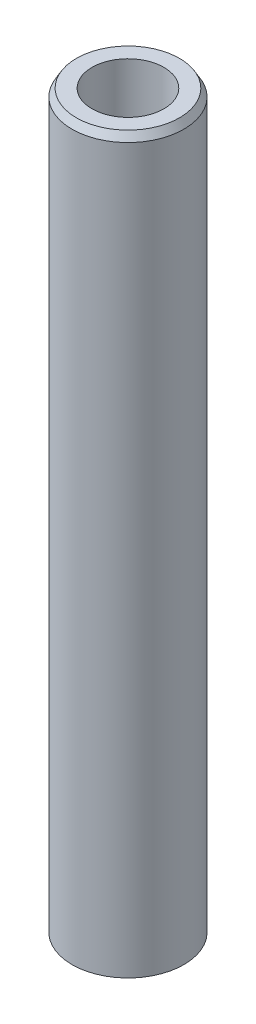
ISO-10303-21;
HEADER;
FILE_DESCRIPTION(('STEP AP214'),'2;1');
FILE_NAME('part.step','',(''),(''),'','','');
FILE_SCHEMA(('AUTOMOTIVE_DESIGN { 1 0 10303 214 1 1 1 1 }'));
ENDSEC;
DATA;
#1=APPLICATION_CONTEXT('core data for automotive mechanical design processes');
#2=APPLICATION_PROTOCOL_DEFINITION('international standard','automotive_design',2000,#1);
#3=PRODUCT_CONTEXT('',#1,'mechanical');
#4=PRODUCT('Part','Part','',(#3));
#5=PRODUCT_RELATED_PRODUCT_CATEGORY('part','',(#4));
#6=PRODUCT_DEFINITION_FORMATION('','',#4);
#7=PRODUCT_DEFINITION_CONTEXT('part definition',#1,'design');
#8=PRODUCT_DEFINITION('design','',#6,#7);
#9=PRODUCT_DEFINITION_SHAPE('','',#8);
#10=(LENGTH_UNIT() NAMED_UNIT(*) SI_UNIT(.MILLI.,.METRE.));
#11=(NAMED_UNIT(*) PLANE_ANGLE_UNIT() SI_UNIT($,.RADIAN.));
#12=(NAMED_UNIT(*) SI_UNIT($,.STERADIAN.) SOLID_ANGLE_UNIT());
#13=UNCERTAINTY_MEASURE_WITH_UNIT(LENGTH_MEASURE(1.E-05),#10,'distance_accuracy_value','');
#14=(GEOMETRIC_REPRESENTATION_CONTEXT(3) GLOBAL_UNCERTAINTY_ASSIGNED_CONTEXT((#13)) GLOBAL_UNIT_ASSIGNED_CONTEXT((#10,
#11,#12)) REPRESENTATION_CONTEXT('',''));
#15=CARTESIAN_POINT('',(0.,0.,0.));
#16=DIRECTION('',(0.,0.,1.));
#17=DIRECTION('',(1.,0.,0.));
#18=AXIS2_PLACEMENT_3D('',#15,#16,#17);
#19=CARTESIAN_POINT('',(0.,492.982544324276,0.));
#20=DIRECTION('',(0.,-1.,0.));
#21=DIRECTION('',(0.,0.,-1.));
#22=AXIS2_PLACEMENT_3D('',#19,#20,#21);
#23=CYLINDRICAL_SURFACE('',#22,37.5);
#24=CARTESIAN_POINT('',(0.,487.858919847031,0.));
#25=DIRECTION('',(0.,1.,0.));
#26=DIRECTION('',(0.,0.,1.));
#27=AXIS2_PLACEMENT_3D('',#24,#25,#26);
#28=CIRCLE('',#27,37.5);
#29=CARTESIAN_POINT('',(0.,487.858919847031,37.5));
#30=VERTEX_POINT('',#29);
#31=EDGE_CURVE('E50',#30,#30,#28,.F.);
#32=ORIENTED_EDGE('',*,*,#31,.T.);
#33=EDGE_LOOP('',(#32));
#34=FACE_BOUND('',#33,.T.);
#35=CARTESIAN_POINT('',(0.,2.95812597116407,0.));
#36=DIRECTION('',(0.,1.,0.));
#37=DIRECTION('',(0.,0.,1.));
#38=AXIS2_PLACEMENT_3D('',#35,#36,#37);
#39=CIRCLE('',#38,37.5);
#40=CARTESIAN_POINT('',(0.,2.95812597116407,37.5));
#41=VERTEX_POINT('',#40);
#42=EDGE_CURVE('E51',#41,#41,#39,.T.);
#43=ORIENTED_EDGE('',*,*,#42,.T.);
#44=EDGE_LOOP('',(#43));
#45=FACE_BOUND('',#44,.T.);
#46=ADVANCED_FACE('F39',(#34,#45),#23,.T.);
#47=CARTESIAN_POINT('',(0.,492.982544324276,0.));
#48=DIRECTION('',(0.,1.,0.));
#49=DIRECTION('',(0.,0.,1.));
#50=AXIS2_PLACEMENT_3D('',#47,#48,#49);
#51=PLANE('',#50);
#52=CARTESIAN_POINT('',(0.,492.982544324276,0.));
#53=DIRECTION('',(0.,1.,0.));
#54=DIRECTION('',(0.,0.,1.));
#55=AXIS2_PLACEMENT_3D('',#52,#53,#54);
#56=CIRCLE('',#55,34.5418740288361);
#57=CARTESIAN_POINT('',(0.,492.982544324276,34.5418740288361));
#58=VERTEX_POINT('',#57);
#59=EDGE_CURVE('E54',#58,#58,#56,.T.);
#60=ORIENTED_EDGE('',*,*,#59,.T.);
#61=EDGE_LOOP('',(#60));
#62=FACE_BOUND('',#61,.T.);
#63=CARTESIAN_POINT('',(0.,492.982544324276,0.));
#64=DIRECTION('',(0.,1.,0.));
#65=DIRECTION('',(0.,0.,1.));
#66=AXIS2_PLACEMENT_3D('',#63,#64,#65);
#67=CIRCLE('',#66,24.0961235973403);
#68=CARTESIAN_POINT('',(0.,492.982544324276,24.0961235973403));
#69=VERTEX_POINT('',#68);
#70=EDGE_CURVE('E58',#69,#69,#67,.T.);
#71=ORIENTED_EDGE('',*,*,#70,.F.);
#72=EDGE_LOOP('',(#71));
#73=FACE_BOUND('',#72,.T.);
#74=ADVANCED_FACE('F69',(#62,#73),#51,.T.);
#75=CARTESIAN_POINT('',(0.,0.,0.));
#76=DIRECTION('',(0.,1.,0.));
#77=DIRECTION('',(0.,0.,1.));
#78=AXIS2_PLACEMENT_3D('',#75,#76,#77);
#79=PLANE('',#78);
#80=CARTESIAN_POINT('',(0.,0.,0.));
#81=DIRECTION('',(0.,1.,0.));
#82=DIRECTION('',(0.,0.,1.));
#83=AXIS2_PLACEMENT_3D('',#80,#81,#82);
#84=CIRCLE('',#83,32.3763755227548);
#85=CARTESIAN_POINT('',(0.,0.,32.3763755227548));
#86=VERTEX_POINT('',#85);
#87=EDGE_CURVE('E10',#86,#86,#84,.F.);
#88=ORIENTED_EDGE('',*,*,#87,.T.);
#89=EDGE_LOOP('',(#88));
#90=FACE_BOUND('',#89,.T.);
#91=CARTESIAN_POINT('',(0.,0.,0.));
#92=DIRECTION('',(0.,1.,0.));
#93=DIRECTION('',(0.,0.,1.));
#94=AXIS2_PLACEMENT_3D('',#91,#92,#93);
#95=CIRCLE('',#94,24.0961235973403);
#96=CARTESIAN_POINT('',(0.,0.,24.0961235973403));
#97=VERTEX_POINT('',#96);
#98=EDGE_CURVE('E63',#97,#97,#95,.T.);
#99=ORIENTED_EDGE('',*,*,#98,.T.);
#100=EDGE_LOOP('',(#99));
#101=FACE_BOUND('',#100,.T.);
#102=ADVANCED_FACE('F75',(#90,#101),#79,.F.);
#103=CARTESIAN_POINT('',(0.,492.982544324276,0.));
#104=DIRECTION('',(0.,-1.,0.));
#105=DIRECTION('',(0.,0.,-1.));
#106=AXIS2_PLACEMENT_3D('',#103,#104,#105);
#107=CYLINDRICAL_SURFACE('',#106,24.0961235973403);
#108=ORIENTED_EDGE('',*,*,#70,.T.);
#109=EDGE_LOOP('',(#108));
#110=FACE_BOUND('',#109,.T.);
#111=ORIENTED_EDGE('',*,*,#98,.F.);
#112=EDGE_LOOP('',(#111));
#113=FACE_BOUND('',#112,.T.);
#114=ADVANCED_FACE('F70',(#110,#113),#107,.F.);
#115=CARTESIAN_POINT('',(0.,492.982544324276,0.));
#116=DIRECTION('',(0.,-1.,0.));
#117=DIRECTION('',(0.,0.,-1.));
#118=AXIS2_PLACEMENT_3D('',#115,#116,#117);
#119=CONICAL_SURFACE('',#118,34.5418740288361,0.523598775598285);
#120=ORIENTED_EDGE('',*,*,#31,.F.);
#121=EDGE_LOOP('',(#120));
#122=FACE_BOUND('',#121,.T.);
#123=ORIENTED_EDGE('',*,*,#59,.F.);
#124=EDGE_LOOP('',(#123));
#125=FACE_BOUND('',#124,.T.);
#126=ADVANCED_FACE('F81',(#122,#125),#119,.T.);
#127=CARTESIAN_POINT('',(0.,2.95812597116407,0.));
#128=DIRECTION('',(0.,1.,0.));
#129=DIRECTION('',(0.,0.,1.));
#130=AXIS2_PLACEMENT_3D('',#127,#128,#129);
#131=CONICAL_SURFACE('',#130,37.5,1.0471975511966);
#132=ORIENTED_EDGE('',*,*,#87,.F.);
#133=EDGE_LOOP('',(#132));
#134=FACE_BOUND('',#133,.T.);
#135=ORIENTED_EDGE('',*,*,#42,.F.);
#136=EDGE_LOOP('',(#135));
#137=FACE_BOUND('',#136,.T.);
#138=ADVANCED_FACE('F45',(#134,#137),#131,.T.);
#139=CLOSED_SHELL('',(#46,#74,#102,#114,#126,#138));
#140=MANIFOLD_SOLID_BREP('B2',#139);
#141=ADVANCED_BREP_SHAPE_REPRESENTATION('',(#18,#140),#14);
#142=SHAPE_DEFINITION_REPRESENTATION(#9,#141);
ENDSEC;
END-ISO-10303-21;
